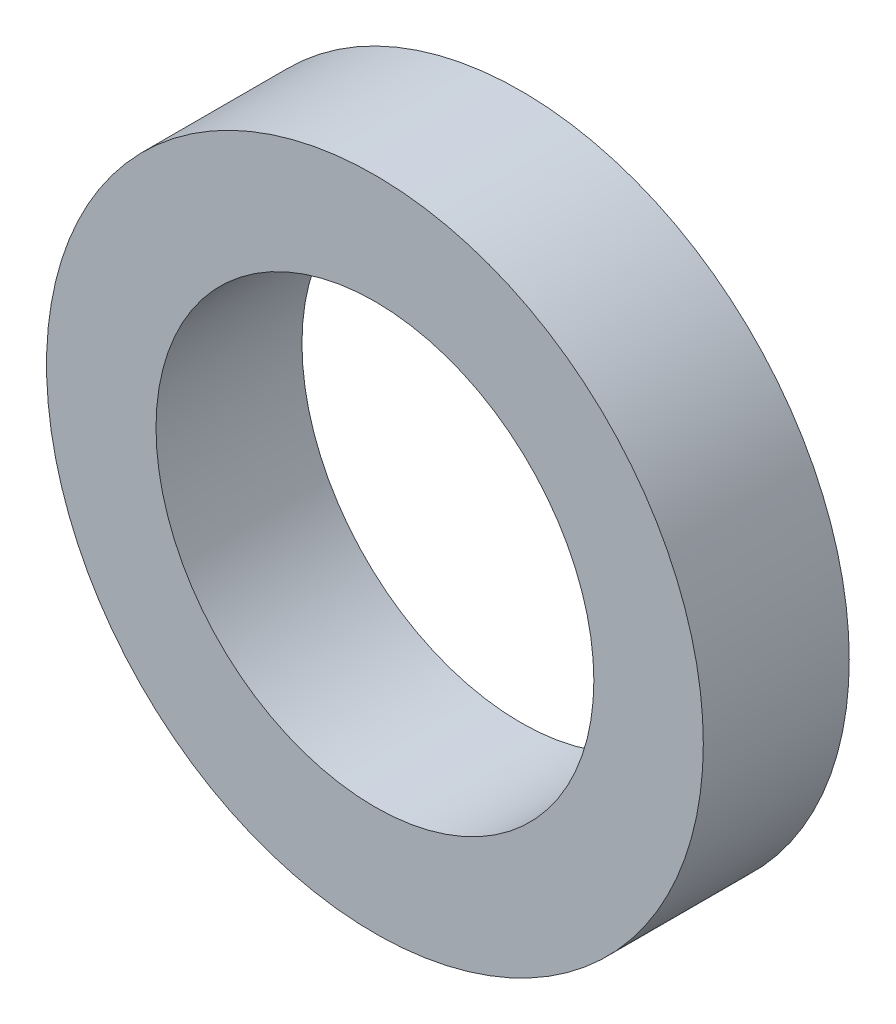
ISO-10303-21;
HEADER;
FILE_DESCRIPTION(('STEP AP214'),'2;1');
FILE_NAME('part.step','',(''),(''),'','','');
FILE_SCHEMA(('AUTOMOTIVE_DESIGN { 1 0 10303 214 1 1 1 1 }'));
ENDSEC;
DATA;
#1=APPLICATION_CONTEXT('core data for automotive mechanical design processes');
#2=APPLICATION_PROTOCOL_DEFINITION('international standard','automotive_design',2000,#1);
#3=PRODUCT_CONTEXT('',#1,'mechanical');
#4=PRODUCT('Part','Part','',(#3));
#5=PRODUCT_RELATED_PRODUCT_CATEGORY('part','',(#4));
#6=PRODUCT_DEFINITION_FORMATION('','',#4);
#7=PRODUCT_DEFINITION_CONTEXT('part definition',#1,'design');
#8=PRODUCT_DEFINITION('design','',#6,#7);
#9=PRODUCT_DEFINITION_SHAPE('','',#8);
#10=(LENGTH_UNIT() NAMED_UNIT(*) SI_UNIT(.MILLI.,.METRE.));
#11=(NAMED_UNIT(*) PLANE_ANGLE_UNIT() SI_UNIT($,.RADIAN.));
#12=(NAMED_UNIT(*) SI_UNIT($,.STERADIAN.) SOLID_ANGLE_UNIT());
#13=UNCERTAINTY_MEASURE_WITH_UNIT(LENGTH_MEASURE(1.E-05),#10,'distance_accuracy_value','');
#14=(GEOMETRIC_REPRESENTATION_CONTEXT(3) GLOBAL_UNCERTAINTY_ASSIGNED_CONTEXT((#13)) GLOBAL_UNIT_ASSIGNED_CONTEXT((#10,
#11,#12)) REPRESENTATION_CONTEXT('',''));
#15=CARTESIAN_POINT('',(0.,0.,0.));
#16=DIRECTION('',(0.,0.,1.));
#17=DIRECTION('',(1.,0.,0.));
#18=AXIS2_PLACEMENT_3D('',#15,#16,#17);
#19=CARTESIAN_POINT('',(0.,0.,4.));
#20=DIRECTION('',(0.,0.,-1.));
#21=DIRECTION('',(-1.,0.,0.));
#22=AXIS2_PLACEMENT_3D('',#19,#20,#21);
#23=CYLINDRICAL_SURFACE('',#22,9.);
#24=CARTESIAN_POINT('',(0.,0.,4.));
#25=DIRECTION('',(0.,0.,1.));
#26=DIRECTION('',(1.,0.,0.));
#27=AXIS2_PLACEMENT_3D('',#24,#25,#26);
#28=CIRCLE('',#27,9.);
#29=CARTESIAN_POINT('',(9.,0.,4.));
#30=VERTEX_POINT('',#29);
#31=EDGE_CURVE('E10',#30,#30,#28,.T.);
#32=ORIENTED_EDGE('',*,*,#31,.F.);
#33=EDGE_LOOP('',(#32));
#34=FACE_BOUND('',#33,.T.);
#35=CARTESIAN_POINT('',(0.,0.,0.));
#36=DIRECTION('',(0.,0.,1.));
#37=DIRECTION('',(1.,0.,0.));
#38=AXIS2_PLACEMENT_3D('',#35,#36,#37);
#39=CIRCLE('',#38,9.);
#40=CARTESIAN_POINT('',(9.,0.,0.));
#41=VERTEX_POINT('',#40);
#42=EDGE_CURVE('E34',#41,#41,#39,.T.);
#43=ORIENTED_EDGE('',*,*,#42,.T.);
#44=EDGE_LOOP('',(#43));
#45=FACE_BOUND('',#44,.T.);
#46=ADVANCED_FACE('F31',(#34,#45),#23,.T.);
#47=CARTESIAN_POINT('',(0.,0.,4.));
#48=DIRECTION('',(0.,0.,1.));
#49=DIRECTION('',(1.,0.,0.));
#50=AXIS2_PLACEMENT_3D('',#47,#48,#49);
#51=PLANE('',#50);
#52=CARTESIAN_POINT('',(0.,0.,4.));
#53=DIRECTION('',(0.,0.,1.));
#54=DIRECTION('',(1.,0.,0.));
#55=AXIS2_PLACEMENT_3D('',#52,#53,#54);
#56=CIRCLE('',#55,6.);
#57=CARTESIAN_POINT('',(6.,0.,4.));
#58=VERTEX_POINT('',#57);
#59=EDGE_CURVE('E43',#58,#58,#56,.T.);
#60=ORIENTED_EDGE('',*,*,#59,.F.);
#61=EDGE_LOOP('',(#60));
#62=FACE_BOUND('',#61,.T.);
#63=ORIENTED_EDGE('',*,*,#31,.T.);
#64=EDGE_LOOP('',(#63));
#65=FACE_BOUND('',#64,.T.);
#66=ADVANCED_FACE('F58',(#62,#65),#51,.T.);
#67=CARTESIAN_POINT('',(0.,0.,0.));
#68=DIRECTION('',(0.,0.,1.));
#69=DIRECTION('',(1.,0.,0.));
#70=AXIS2_PLACEMENT_3D('',#67,#68,#69);
#71=PLANE('',#70);
#72=CARTESIAN_POINT('',(0.,0.,0.));
#73=DIRECTION('',(0.,0.,1.));
#74=DIRECTION('',(1.,0.,0.));
#75=AXIS2_PLACEMENT_3D('',#72,#73,#74);
#76=CIRCLE('',#75,6.);
#77=CARTESIAN_POINT('',(6.,0.,0.));
#78=VERTEX_POINT('',#77);
#79=EDGE_CURVE('E41',#78,#78,#76,.T.);
#80=ORIENTED_EDGE('',*,*,#79,.T.);
#81=EDGE_LOOP('',(#80));
#82=FACE_BOUND('',#81,.T.);
#83=ORIENTED_EDGE('',*,*,#42,.F.);
#84=EDGE_LOOP('',(#83));
#85=FACE_BOUND('',#84,.T.);
#86=ADVANCED_FACE('F49',(#82,#85),#71,.F.);
#87=CARTESIAN_POINT('',(0.,0.,0.));
#88=DIRECTION('',(0.,0.,1.));
#89=DIRECTION('',(1.,0.,0.));
#90=AXIS2_PLACEMENT_3D('',#87,#88,#89);
#91=CYLINDRICAL_SURFACE('',#90,6.);
#92=ORIENTED_EDGE('',*,*,#79,.F.);
#93=EDGE_LOOP('',(#92));
#94=FACE_BOUND('',#93,.T.);
#95=ORIENTED_EDGE('',*,*,#59,.T.);
#96=EDGE_LOOP('',(#95));
#97=FACE_BOUND('',#96,.T.);
#98=ADVANCED_FACE('F52',(#94,#97),#91,.F.);
#99=CLOSED_SHELL('',(#46,#66,#86,#98));
#100=MANIFOLD_SOLID_BREP('B2',#99);
#101=ADVANCED_BREP_SHAPE_REPRESENTATION('',(#18,#100),#14);
#102=SHAPE_DEFINITION_REPRESENTATION(#9,#101);
ENDSEC;
END-ISO-10303-21;
